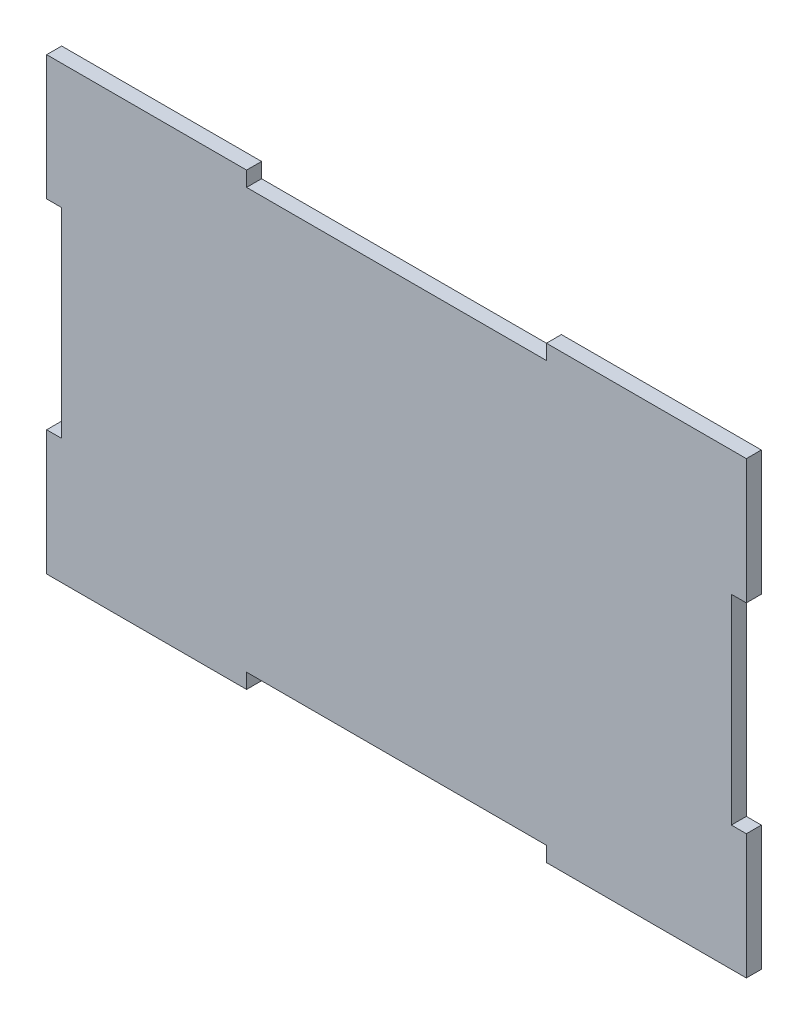
ISO-10303-21;
HEADER;
FILE_DESCRIPTION(('STEP AP214'),'2;1');
FILE_NAME('part.step','',(''),(''),'','','');
FILE_SCHEMA(('AUTOMOTIVE_DESIGN { 1 0 10303 214 1 1 1 1 }'));
ENDSEC;
DATA;
#1=APPLICATION_CONTEXT('core data for automotive mechanical design processes');
#2=APPLICATION_PROTOCOL_DEFINITION('international standard','automotive_design',2000,#1);
#3=PRODUCT_CONTEXT('',#1,'mechanical');
#4=PRODUCT('Part','Part','',(#3));
#5=PRODUCT_RELATED_PRODUCT_CATEGORY('part','',(#4));
#6=PRODUCT_DEFINITION_FORMATION('','',#4);
#7=PRODUCT_DEFINITION_CONTEXT('part definition',#1,'design');
#8=PRODUCT_DEFINITION('design','',#6,#7);
#9=PRODUCT_DEFINITION_SHAPE('','',#8);
#10=(LENGTH_UNIT() NAMED_UNIT(*) SI_UNIT(.MILLI.,.METRE.));
#11=(NAMED_UNIT(*) PLANE_ANGLE_UNIT() SI_UNIT($,.RADIAN.));
#12=(NAMED_UNIT(*) SI_UNIT($,.STERADIAN.) SOLID_ANGLE_UNIT());
#13=UNCERTAINTY_MEASURE_WITH_UNIT(LENGTH_MEASURE(1.E-05),#10,'distance_accuracy_value','');
#14=(GEOMETRIC_REPRESENTATION_CONTEXT(3) GLOBAL_UNCERTAINTY_ASSIGNED_CONTEXT((#13)) GLOBAL_UNIT_ASSIGNED_CONTEXT((#10,
#11,#12)) REPRESENTATION_CONTEXT('',''));
#15=CARTESIAN_POINT('',(0.,0.,0.));
#16=DIRECTION('',(0.,0.,1.));
#17=DIRECTION('',(1.,0.,0.));
#18=AXIS2_PLACEMENT_3D('',#15,#16,#17);
#19=CARTESIAN_POINT('',(0.,0.,3.));
#20=DIRECTION('',(1.,0.,0.));
#21=DIRECTION('',(0.,0.,-1.));
#22=AXIS2_PLACEMENT_3D('',#19,#20,#21);
#23=PLANE('',#22);
#24=DIRECTION('',(0.,-1.,0.));
#25=VECTOR('',#24,1.);
#26=CARTESIAN_POINT('',(0.,0.,0.));
#27=LINE('',#26,#25);
#28=CARTESIAN_POINT('',(0.,25.,0.));
#29=VERTEX_POINT('',#28);
#30=CARTESIAN_POINT('',(0.,0.,0.));
#31=VERTEX_POINT('',#30);
#32=EDGE_CURVE('E202',#29,#31,#27,.T.);
#33=ORIENTED_EDGE('',*,*,#32,.T.);
#34=DIRECTION('',(0.,0.,-1.));
#35=VECTOR('',#34,1.);
#36=CARTESIAN_POINT('',(0.,0.,3.));
#37=LINE('',#36,#35);
#38=CARTESIAN_POINT('',(0.,0.,3.));
#39=VERTEX_POINT('',#38);
#40=EDGE_CURVE('E11',#39,#31,#37,.T.);
#41=ORIENTED_EDGE('',*,*,#40,.F.);
#42=DIRECTION('',(0.,-1.,0.));
#43=VECTOR('',#42,1.);
#44=CARTESIAN_POINT('',(0.,0.,3.));
#45=LINE('',#44,#43);
#46=CARTESIAN_POINT('',(0.,25.,3.));
#47=VERTEX_POINT('',#46);
#48=EDGE_CURVE('E240',#47,#39,#45,.T.);
#49=ORIENTED_EDGE('',*,*,#48,.F.);
#50=DIRECTION('',(0.,0.,-1.));
#51=VECTOR('',#50,1.);
#52=CARTESIAN_POINT('',(0.,25.,3.));
#53=LINE('',#52,#51);
#54=EDGE_CURVE('E198',#47,#29,#53,.T.);
#55=ORIENTED_EDGE('',*,*,#54,.T.);
#56=EDGE_LOOP('',(#33,#41,#49,#55));
#57=FACE_BOUND('',#56,.T.);
#58=ADVANCED_FACE('F34',(#57),#23,.F.);
#59=CARTESIAN_POINT('',(0.,0.,3.));
#60=DIRECTION('',(0.,1.,0.));
#61=DIRECTION('',(0.,0.,1.));
#62=AXIS2_PLACEMENT_3D('',#59,#60,#61);
#63=PLANE('',#62);
#64=DIRECTION('',(1.,0.,0.));
#65=VECTOR('',#64,1.);
#66=CARTESIAN_POINT('',(0.,0.,0.));
#67=LINE('',#66,#65);
#68=CARTESIAN_POINT('',(40.,0.,0.));
#69=VERTEX_POINT('',#68);
#70=EDGE_CURVE('E205',#31,#69,#67,.T.);
#71=ORIENTED_EDGE('',*,*,#70,.T.);
#72=DIRECTION('',(0.,0.,-1.));
#73=VECTOR('',#72,1.);
#74=CARTESIAN_POINT('',(40.,0.,3.));
#75=LINE('',#74,#73);
#76=CARTESIAN_POINT('',(40.,0.,3.));
#77=VERTEX_POINT('',#76);
#78=EDGE_CURVE('E42',#77,#69,#75,.T.);
#79=ORIENTED_EDGE('',*,*,#78,.F.);
#80=DIRECTION('',(1.,0.,0.));
#81=VECTOR('',#80,1.);
#82=CARTESIAN_POINT('',(0.,0.,3.));
#83=LINE('',#82,#81);
#84=EDGE_CURVE('E129',#39,#77,#83,.T.);
#85=ORIENTED_EDGE('',*,*,#84,.F.);
#86=ORIENTED_EDGE('',*,*,#40,.T.);
#87=EDGE_LOOP('',(#71,#79,#85,#86));
#88=FACE_BOUND('',#87,.T.);
#89=ADVANCED_FACE('F358',(#88),#63,.F.);
#90=CARTESIAN_POINT('',(40.,0.,3.));
#91=DIRECTION('',(-1.,0.,0.));
#92=DIRECTION('',(0.,0.,1.));
#93=AXIS2_PLACEMENT_3D('',#90,#91,#92);
#94=PLANE('',#93);
#95=DIRECTION('',(0.,1.,0.));
#96=VECTOR('',#95,1.);
#97=CARTESIAN_POINT('',(40.,0.,0.));
#98=LINE('',#97,#96);
#99=CARTESIAN_POINT('',(40.,3.,0.));
#100=VERTEX_POINT('',#99);
#101=EDGE_CURVE('E207',#69,#100,#98,.T.);
#102=ORIENTED_EDGE('',*,*,#101,.T.);
#103=DIRECTION('',(0.,0.,-1.));
#104=VECTOR('',#103,1.);
#105=CARTESIAN_POINT('',(40.,3.,3.));
#106=LINE('',#105,#104);
#107=CARTESIAN_POINT('',(40.,3.,3.));
#108=VERTEX_POINT('',#107);
#109=EDGE_CURVE('E283',#108,#100,#106,.T.);
#110=ORIENTED_EDGE('',*,*,#109,.F.);
#111=DIRECTION('',(0.,1.,0.));
#112=VECTOR('',#111,1.);
#113=CARTESIAN_POINT('',(40.,0.,3.));
#114=LINE('',#113,#112);
#115=EDGE_CURVE('E291',#77,#108,#114,.T.);
#116=ORIENTED_EDGE('',*,*,#115,.F.);
#117=ORIENTED_EDGE('',*,*,#78,.T.);
#118=EDGE_LOOP('',(#102,#110,#116,#117));
#119=FACE_BOUND('',#118,.T.);
#120=ADVANCED_FACE('F289',(#119),#94,.F.);
#121=CARTESIAN_POINT('',(40.,3.,3.));
#122=DIRECTION('',(0.,1.,0.));
#123=DIRECTION('',(-1.,0.,0.));
#124=AXIS2_PLACEMENT_3D('',#121,#122,#123);
#125=PLANE('',#124);
#126=DIRECTION('',(1.,0.,0.));
#127=VECTOR('',#126,1.);
#128=CARTESIAN_POINT('',(40.,3.,0.));
#129=LINE('',#128,#127);
#130=CARTESIAN_POINT('',(100.,3.,0.));
#131=VERTEX_POINT('',#130);
#132=EDGE_CURVE('E209',#100,#131,#129,.T.);
#133=ORIENTED_EDGE('',*,*,#132,.T.);
#134=DIRECTION('',(0.,0.,-1.));
#135=VECTOR('',#134,1.);
#136=CARTESIAN_POINT('',(100.,3.,3.));
#137=LINE('',#136,#135);
#138=CARTESIAN_POINT('',(100.,3.,3.));
#139=VERTEX_POINT('',#138);
#140=EDGE_CURVE('E280',#139,#131,#137,.T.);
#141=ORIENTED_EDGE('',*,*,#140,.F.);
#142=DIRECTION('',(1.,0.,0.));
#143=VECTOR('',#142,1.);
#144=CARTESIAN_POINT('',(40.,3.,3.));
#145=LINE('',#144,#143);
#146=EDGE_CURVE('E309',#108,#139,#145,.T.);
#147=ORIENTED_EDGE('',*,*,#146,.F.);
#148=ORIENTED_EDGE('',*,*,#109,.T.);
#149=EDGE_LOOP('',(#133,#141,#147,#148));
#150=FACE_BOUND('',#149,.T.);
#151=ADVANCED_FACE('F300',(#150),#125,.F.);
#152=CARTESIAN_POINT('',(100.,0.,3.));
#153=DIRECTION('',(1.,0.,0.));
#154=DIRECTION('',(0.,0.,-1.));
#155=AXIS2_PLACEMENT_3D('',#152,#153,#154);
#156=PLANE('',#155);
#157=DIRECTION('',(0.,-1.,0.));
#158=VECTOR('',#157,1.);
#159=CARTESIAN_POINT('',(100.,0.,0.));
#160=LINE('',#159,#158);
#161=CARTESIAN_POINT('',(100.,0.,0.));
#162=VERTEX_POINT('',#161);
#163=EDGE_CURVE('E211',#131,#162,#160,.T.);
#164=ORIENTED_EDGE('',*,*,#163,.T.);
#165=DIRECTION('',(0.,0.,-1.));
#166=VECTOR('',#165,1.);
#167=CARTESIAN_POINT('',(100.,0.,3.));
#168=LINE('',#167,#166);
#169=CARTESIAN_POINT('',(100.,0.,3.));
#170=VERTEX_POINT('',#169);
#171=EDGE_CURVE('E277',#170,#162,#168,.T.);
#172=ORIENTED_EDGE('',*,*,#171,.F.);
#173=DIRECTION('',(0.,-1.,0.));
#174=VECTOR('',#173,1.);
#175=CARTESIAN_POINT('',(100.,0.,3.));
#176=LINE('',#175,#174);
#177=EDGE_CURVE('E306',#139,#170,#176,.T.);
#178=ORIENTED_EDGE('',*,*,#177,.F.);
#179=ORIENTED_EDGE('',*,*,#140,.T.);
#180=EDGE_LOOP('',(#164,#172,#178,#179));
#181=FACE_BOUND('',#180,.T.);
#182=ADVANCED_FACE('F304',(#181),#156,.F.);
#183=CARTESIAN_POINT('',(140.,0.,3.));
#184=DIRECTION('',(0.,1.,0.));
#185=DIRECTION('',(0.,0.,1.));
#186=AXIS2_PLACEMENT_3D('',#183,#184,#185);
#187=PLANE('',#186);
#188=DIRECTION('',(1.,0.,0.));
#189=VECTOR('',#188,1.);
#190=CARTESIAN_POINT('',(140.,0.,0.));
#191=LINE('',#190,#189);
#192=CARTESIAN_POINT('',(140.,0.,0.));
#193=VERTEX_POINT('',#192);
#194=EDGE_CURVE('E213',#162,#193,#191,.T.);
#195=ORIENTED_EDGE('',*,*,#194,.T.);
#196=DIRECTION('',(0.,0.,-1.));
#197=VECTOR('',#196,1.);
#198=CARTESIAN_POINT('',(140.,0.,3.));
#199=LINE('',#198,#197);
#200=CARTESIAN_POINT('',(140.,0.,3.));
#201=VERTEX_POINT('',#200);
#202=EDGE_CURVE('E274',#201,#193,#199,.T.);
#203=ORIENTED_EDGE('',*,*,#202,.F.);
#204=DIRECTION('',(1.,0.,0.));
#205=VECTOR('',#204,1.);
#206=CARTESIAN_POINT('',(140.,0.,3.));
#207=LINE('',#206,#205);
#208=EDGE_CURVE('E308',#170,#201,#207,.T.);
#209=ORIENTED_EDGE('',*,*,#208,.F.);
#210=ORIENTED_EDGE('',*,*,#171,.T.);
#211=EDGE_LOOP('',(#195,#203,#209,#210));
#212=FACE_BOUND('',#211,.T.);
#213=ADVANCED_FACE('F371',(#212),#187,.F.);
#214=CARTESIAN_POINT('',(140.,0.,3.));
#215=DIRECTION('',(-1.,0.,0.));
#216=DIRECTION('',(0.,0.,1.));
#217=AXIS2_PLACEMENT_3D('',#214,#215,#216);
#218=PLANE('',#217);
#219=DIRECTION('',(0.,1.,0.));
#220=VECTOR('',#219,1.);
#221=CARTESIAN_POINT('',(140.,0.,0.));
#222=LINE('',#221,#220);
#223=CARTESIAN_POINT('',(140.,25.,0.));
#224=VERTEX_POINT('',#223);
#225=EDGE_CURVE('E215',#193,#224,#222,.T.);
#226=ORIENTED_EDGE('',*,*,#225,.T.);
#227=DIRECTION('',(0.,0.,-1.));
#228=VECTOR('',#227,1.);
#229=CARTESIAN_POINT('',(140.,25.,3.));
#230=LINE('',#229,#228);
#231=CARTESIAN_POINT('',(140.,25.,3.));
#232=VERTEX_POINT('',#231);
#233=EDGE_CURVE('E271',#232,#224,#230,.T.);
#234=ORIENTED_EDGE('',*,*,#233,.F.);
#235=DIRECTION('',(0.,1.,0.));
#236=VECTOR('',#235,1.);
#237=CARTESIAN_POINT('',(140.,0.,3.));
#238=LINE('',#237,#236);
#239=EDGE_CURVE('E311',#201,#232,#238,.T.);
#240=ORIENTED_EDGE('',*,*,#239,.F.);
#241=ORIENTED_EDGE('',*,*,#202,.T.);
#242=EDGE_LOOP('',(#226,#234,#240,#241));
#243=FACE_BOUND('',#242,.T.);
#244=ADVANCED_FACE('F374',(#243),#218,.F.);
#245=CARTESIAN_POINT('',(140.,25.,3.));
#246=DIRECTION('',(0.,-1.,0.));
#247=DIRECTION('',(0.,0.,-1.));
#248=AXIS2_PLACEMENT_3D('',#245,#246,#247);
#249=PLANE('',#248);
#250=DIRECTION('',(-1.,0.,0.));
#251=VECTOR('',#250,1.);
#252=CARTESIAN_POINT('',(140.,25.,0.));
#253=LINE('',#252,#251);
#254=CARTESIAN_POINT('',(137.,25.,0.));
#255=VERTEX_POINT('',#254);
#256=EDGE_CURVE('E217',#224,#255,#253,.T.);
#257=ORIENTED_EDGE('',*,*,#256,.T.);
#258=DIRECTION('',(0.,0.,-1.));
#259=VECTOR('',#258,1.);
#260=CARTESIAN_POINT('',(137.,25.,3.));
#261=LINE('',#260,#259);
#262=CARTESIAN_POINT('',(137.,25.,3.));
#263=VERTEX_POINT('',#262);
#264=EDGE_CURVE('E268',#263,#255,#261,.T.);
#265=ORIENTED_EDGE('',*,*,#264,.F.);
#266=DIRECTION('',(-1.,0.,0.));
#267=VECTOR('',#266,1.);
#268=CARTESIAN_POINT('',(140.,25.,3.));
#269=LINE('',#268,#267);
#270=EDGE_CURVE('E317',#232,#263,#269,.T.);
#271=ORIENTED_EDGE('',*,*,#270,.F.);
#272=ORIENTED_EDGE('',*,*,#233,.T.);
#273=EDGE_LOOP('',(#257,#265,#271,#272));
#274=FACE_BOUND('',#273,.T.);
#275=ADVANCED_FACE('F378',(#274),#249,.F.);
#276=CARTESIAN_POINT('',(137.,25.,3.));
#277=DIRECTION('',(-1.,0.,0.));
#278=DIRECTION('',(0.,0.,1.));
#279=AXIS2_PLACEMENT_3D('',#276,#277,#278);
#280=PLANE('',#279);
#281=DIRECTION('',(0.,1.,0.));
#282=VECTOR('',#281,1.);
#283=CARTESIAN_POINT('',(137.,25.,0.));
#284=LINE('',#283,#282);
#285=CARTESIAN_POINT('',(137.,65.,0.));
#286=VERTEX_POINT('',#285);
#287=EDGE_CURVE('E219',#255,#286,#284,.T.);
#288=ORIENTED_EDGE('',*,*,#287,.T.);
#289=DIRECTION('',(0.,0.,-1.));
#290=VECTOR('',#289,1.);
#291=CARTESIAN_POINT('',(137.,65.,3.));
#292=LINE('',#291,#290);
#293=CARTESIAN_POINT('',(137.,65.,3.));
#294=VERTEX_POINT('',#293);
#295=EDGE_CURVE('E265',#294,#286,#292,.T.);
#296=ORIENTED_EDGE('',*,*,#295,.F.);
#297=DIRECTION('',(0.,1.,0.));
#298=VECTOR('',#297,1.);
#299=CARTESIAN_POINT('',(137.,25.,3.));
#300=LINE('',#299,#298);
#301=EDGE_CURVE('E319',#263,#294,#300,.T.);
#302=ORIENTED_EDGE('',*,*,#301,.F.);
#303=ORIENTED_EDGE('',*,*,#264,.T.);
#304=EDGE_LOOP('',(#288,#296,#302,#303));
#305=FACE_BOUND('',#304,.T.);
#306=ADVANCED_FACE('F382',(#305),#280,.F.);
#307=CARTESIAN_POINT('',(140.,65.,3.));
#308=DIRECTION('',(0.,1.,0.));
#309=DIRECTION('',(0.,0.,1.));
#310=AXIS2_PLACEMENT_3D('',#307,#308,#309);
#311=PLANE('',#310);
#312=DIRECTION('',(1.,0.,0.));
#313=VECTOR('',#312,1.);
#314=CARTESIAN_POINT('',(140.,65.,0.));
#315=LINE('',#314,#313);
#316=CARTESIAN_POINT('',(140.,65.,0.));
#317=VERTEX_POINT('',#316);
#318=EDGE_CURVE('E221',#286,#317,#315,.T.);
#319=ORIENTED_EDGE('',*,*,#318,.T.);
#320=DIRECTION('',(0.,0.,-1.));
#321=VECTOR('',#320,1.);
#322=CARTESIAN_POINT('',(140.,65.,3.));
#323=LINE('',#322,#321);
#324=CARTESIAN_POINT('',(140.,65.,3.));
#325=VERTEX_POINT('',#324);
#326=EDGE_CURVE('E262',#325,#317,#323,.T.);
#327=ORIENTED_EDGE('',*,*,#326,.F.);
#328=DIRECTION('',(1.,0.,0.));
#329=VECTOR('',#328,1.);
#330=CARTESIAN_POINT('',(140.,65.,3.));
#331=LINE('',#330,#329);
#332=EDGE_CURVE('E321',#294,#325,#331,.T.);
#333=ORIENTED_EDGE('',*,*,#332,.F.);
#334=ORIENTED_EDGE('',*,*,#295,.T.);
#335=EDGE_LOOP('',(#319,#327,#333,#334));
#336=FACE_BOUND('',#335,.T.);
#337=ADVANCED_FACE('F386',(#336),#311,.F.);
#338=CARTESIAN_POINT('',(140.,90.,3.));
#339=DIRECTION('',(-1.,0.,0.));
#340=DIRECTION('',(0.,0.,1.));
#341=AXIS2_PLACEMENT_3D('',#338,#339,#340);
#342=PLANE('',#341);
#343=DIRECTION('',(0.,1.,0.));
#344=VECTOR('',#343,1.);
#345=CARTESIAN_POINT('',(140.,90.,0.));
#346=LINE('',#345,#344);
#347=CARTESIAN_POINT('',(140.,90.,0.));
#348=VERTEX_POINT('',#347);
#349=EDGE_CURVE('E223',#317,#348,#346,.T.);
#350=ORIENTED_EDGE('',*,*,#349,.T.);
#351=DIRECTION('',(0.,0.,-1.));
#352=VECTOR('',#351,1.);
#353=CARTESIAN_POINT('',(140.,90.,3.));
#354=LINE('',#353,#352);
#355=CARTESIAN_POINT('',(140.,90.,3.));
#356=VERTEX_POINT('',#355);
#357=EDGE_CURVE('E259',#356,#348,#354,.T.);
#358=ORIENTED_EDGE('',*,*,#357,.F.);
#359=DIRECTION('',(0.,1.,0.));
#360=VECTOR('',#359,1.);
#361=CARTESIAN_POINT('',(140.,90.,3.));
#362=LINE('',#361,#360);
#363=EDGE_CURVE('E323',#325,#356,#362,.T.);
#364=ORIENTED_EDGE('',*,*,#363,.F.);
#365=ORIENTED_EDGE('',*,*,#326,.T.);
#366=EDGE_LOOP('',(#350,#358,#364,#365));
#367=FACE_BOUND('',#366,.T.);
#368=ADVANCED_FACE('F390',(#367),#342,.F.);
#369=CARTESIAN_POINT('',(140.,90.,3.));
#370=DIRECTION('',(0.,-1.,0.));
#371=DIRECTION('',(0.,0.,-1.));
#372=AXIS2_PLACEMENT_3D('',#369,#370,#371);
#373=PLANE('',#372);
#374=DIRECTION('',(-1.,0.,0.));
#375=VECTOR('',#374,1.);
#376=CARTESIAN_POINT('',(140.,90.,0.));
#377=LINE('',#376,#375);
#378=CARTESIAN_POINT('',(100.,90.,0.));
#379=VERTEX_POINT('',#378);
#380=EDGE_CURVE('E225',#348,#379,#377,.T.);
#381=ORIENTED_EDGE('',*,*,#380,.T.);
#382=DIRECTION('',(0.,0.,-1.));
#383=VECTOR('',#382,1.);
#384=CARTESIAN_POINT('',(100.,90.,3.));
#385=LINE('',#384,#383);
#386=CARTESIAN_POINT('',(100.,90.,3.));
#387=VERTEX_POINT('',#386);
#388=EDGE_CURVE('E256',#387,#379,#385,.T.);
#389=ORIENTED_EDGE('',*,*,#388,.F.);
#390=DIRECTION('',(-1.,0.,0.));
#391=VECTOR('',#390,1.);
#392=CARTESIAN_POINT('',(140.,90.,3.));
#393=LINE('',#392,#391);
#394=EDGE_CURVE('E325',#356,#387,#393,.T.);
#395=ORIENTED_EDGE('',*,*,#394,.F.);
#396=ORIENTED_EDGE('',*,*,#357,.T.);
#397=EDGE_LOOP('',(#381,#389,#395,#396));
#398=FACE_BOUND('',#397,.T.);
#399=ADVANCED_FACE('F394',(#398),#373,.F.);
#400=CARTESIAN_POINT('',(100.,90.,3.));
#401=DIRECTION('',(1.,0.,0.));
#402=DIRECTION('',(0.,0.,-1.));
#403=AXIS2_PLACEMENT_3D('',#400,#401,#402);
#404=PLANE('',#403);
#405=DIRECTION('',(0.,-1.,0.));
#406=VECTOR('',#405,1.);
#407=CARTESIAN_POINT('',(100.,90.,0.));
#408=LINE('',#407,#406);
#409=CARTESIAN_POINT('',(100.,87.,0.));
#410=VERTEX_POINT('',#409);
#411=EDGE_CURVE('E227',#379,#410,#408,.T.);
#412=ORIENTED_EDGE('',*,*,#411,.T.);
#413=DIRECTION('',(0.,0.,-1.));
#414=VECTOR('',#413,1.);
#415=CARTESIAN_POINT('',(100.,87.,3.));
#416=LINE('',#415,#414);
#417=CARTESIAN_POINT('',(100.,87.,3.));
#418=VERTEX_POINT('',#417);
#419=EDGE_CURVE('E253',#418,#410,#416,.T.);
#420=ORIENTED_EDGE('',*,*,#419,.F.);
#421=DIRECTION('',(0.,-1.,0.));
#422=VECTOR('',#421,1.);
#423=CARTESIAN_POINT('',(100.,90.,3.));
#424=LINE('',#423,#422);
#425=EDGE_CURVE('E327',#387,#418,#424,.T.);
#426=ORIENTED_EDGE('',*,*,#425,.F.);
#427=ORIENTED_EDGE('',*,*,#388,.T.);
#428=EDGE_LOOP('',(#412,#420,#426,#427));
#429=FACE_BOUND('',#428,.T.);
#430=ADVANCED_FACE('F398',(#429),#404,.F.);
#431=CARTESIAN_POINT('',(40.,87.,3.));
#432=DIRECTION('',(0.,-1.,0.));
#433=DIRECTION('',(0.,0.,-1.));
#434=AXIS2_PLACEMENT_3D('',#431,#432,#433);
#435=PLANE('',#434);
#436=DIRECTION('',(-1.,0.,0.));
#437=VECTOR('',#436,1.);
#438=CARTESIAN_POINT('',(40.,87.,0.));
#439=LINE('',#438,#437);
#440=CARTESIAN_POINT('',(40.,87.,0.));
#441=VERTEX_POINT('',#440);
#442=EDGE_CURVE('E229',#410,#441,#439,.T.);
#443=ORIENTED_EDGE('',*,*,#442,.T.);
#444=DIRECTION('',(0.,0.,-1.));
#445=VECTOR('',#444,1.);
#446=CARTESIAN_POINT('',(40.,87.,3.));
#447=LINE('',#446,#445);
#448=CARTESIAN_POINT('',(40.,87.,3.));
#449=VERTEX_POINT('',#448);
#450=EDGE_CURVE('E250',#449,#441,#447,.T.);
#451=ORIENTED_EDGE('',*,*,#450,.F.);
#452=DIRECTION('',(-1.,0.,0.));
#453=VECTOR('',#452,1.);
#454=CARTESIAN_POINT('',(40.,87.,3.));
#455=LINE('',#454,#453);
#456=EDGE_CURVE('E329',#418,#449,#455,.T.);
#457=ORIENTED_EDGE('',*,*,#456,.F.);
#458=ORIENTED_EDGE('',*,*,#419,.T.);
#459=EDGE_LOOP('',(#443,#451,#457,#458));
#460=FACE_BOUND('',#459,.T.);
#461=ADVANCED_FACE('F402',(#460),#435,.F.);
#462=CARTESIAN_POINT('',(40.,90.,3.));
#463=DIRECTION('',(-1.,0.,0.));
#464=DIRECTION('',(0.,0.,1.));
#465=AXIS2_PLACEMENT_3D('',#462,#463,#464);
#466=PLANE('',#465);
#467=DIRECTION('',(0.,1.,0.));
#468=VECTOR('',#467,1.);
#469=CARTESIAN_POINT('',(40.,90.,0.));
#470=LINE('',#469,#468);
#471=CARTESIAN_POINT('',(40.,90.,0.));
#472=VERTEX_POINT('',#471);
#473=EDGE_CURVE('E231',#441,#472,#470,.T.);
#474=ORIENTED_EDGE('',*,*,#473,.T.);
#475=DIRECTION('',(0.,0.,-1.));
#476=VECTOR('',#475,1.);
#477=CARTESIAN_POINT('',(40.,90.,3.));
#478=LINE('',#477,#476);
#479=CARTESIAN_POINT('',(40.,90.,3.));
#480=VERTEX_POINT('',#479);
#481=EDGE_CURVE('E247',#480,#472,#478,.T.);
#482=ORIENTED_EDGE('',*,*,#481,.F.);
#483=DIRECTION('',(0.,1.,0.));
#484=VECTOR('',#483,1.);
#485=CARTESIAN_POINT('',(40.,90.,3.));
#486=LINE('',#485,#484);
#487=EDGE_CURVE('E331',#449,#480,#486,.T.);
#488=ORIENTED_EDGE('',*,*,#487,.F.);
#489=ORIENTED_EDGE('',*,*,#450,.T.);
#490=EDGE_LOOP('',(#474,#482,#488,#489));
#491=FACE_BOUND('',#490,.T.);
#492=ADVANCED_FACE('F406',(#491),#466,.F.);
#493=CARTESIAN_POINT('',(0.,90.,3.));
#494=DIRECTION('',(0.,-1.,0.));
#495=DIRECTION('',(0.,0.,-1.));
#496=AXIS2_PLACEMENT_3D('',#493,#494,#495);
#497=PLANE('',#496);
#498=DIRECTION('',(-1.,0.,0.));
#499=VECTOR('',#498,1.);
#500=CARTESIAN_POINT('',(0.,90.,0.));
#501=LINE('',#500,#499);
#502=CARTESIAN_POINT('',(0.,90.,0.));
#503=VERTEX_POINT('',#502);
#504=EDGE_CURVE('E233',#472,#503,#501,.T.);
#505=ORIENTED_EDGE('',*,*,#504,.T.);
#506=DIRECTION('',(0.,0.,-1.));
#507=VECTOR('',#506,1.);
#508=CARTESIAN_POINT('',(0.,90.,3.));
#509=LINE('',#508,#507);
#510=CARTESIAN_POINT('',(0.,90.,3.));
#511=VERTEX_POINT('',#510);
#512=EDGE_CURVE('E244',#511,#503,#509,.T.);
#513=ORIENTED_EDGE('',*,*,#512,.F.);
#514=DIRECTION('',(-1.,0.,0.));
#515=VECTOR('',#514,1.);
#516=CARTESIAN_POINT('',(0.,90.,3.));
#517=LINE('',#516,#515);
#518=EDGE_CURVE('E333',#480,#511,#517,.T.);
#519=ORIENTED_EDGE('',*,*,#518,.F.);
#520=ORIENTED_EDGE('',*,*,#481,.T.);
#521=EDGE_LOOP('',(#505,#513,#519,#520));
#522=FACE_BOUND('',#521,.T.);
#523=ADVANCED_FACE('F339',(#522),#497,.F.);
#524=CARTESIAN_POINT('',(0.,90.,3.));
#525=DIRECTION('',(1.,0.,0.));
#526=DIRECTION('',(0.,0.,-1.));
#527=AXIS2_PLACEMENT_3D('',#524,#525,#526);
#528=PLANE('',#527);
#529=DIRECTION('',(0.,-1.,0.));
#530=VECTOR('',#529,1.);
#531=CARTESIAN_POINT('',(0.,90.,0.));
#532=LINE('',#531,#530);
#533=CARTESIAN_POINT('',(0.,65.,0.));
#534=VERTEX_POINT('',#533);
#535=EDGE_CURVE('E235',#503,#534,#532,.T.);
#536=ORIENTED_EDGE('',*,*,#535,.T.);
#537=DIRECTION('',(0.,0.,-1.));
#538=VECTOR('',#537,1.);
#539=CARTESIAN_POINT('',(0.,65.,3.));
#540=LINE('',#539,#538);
#541=CARTESIAN_POINT('',(0.,65.,3.));
#542=VERTEX_POINT('',#541);
#543=EDGE_CURVE('E193',#542,#534,#540,.T.);
#544=ORIENTED_EDGE('',*,*,#543,.F.);
#545=DIRECTION('',(0.,-1.,0.));
#546=VECTOR('',#545,1.);
#547=CARTESIAN_POINT('',(0.,90.,3.));
#548=LINE('',#547,#546);
#549=EDGE_CURVE('E184',#511,#542,#548,.T.);
#550=ORIENTED_EDGE('',*,*,#549,.F.);
#551=ORIENTED_EDGE('',*,*,#512,.T.);
#552=EDGE_LOOP('',(#536,#544,#550,#551));
#553=FACE_BOUND('',#552,.T.);
#554=ADVANCED_FACE('F343',(#553),#528,.F.);
#555=CARTESIAN_POINT('',(0.,65.,3.));
#556=DIRECTION('',(0.,1.,0.));
#557=DIRECTION('',(0.,0.,1.));
#558=AXIS2_PLACEMENT_3D('',#555,#556,#557);
#559=PLANE('',#558);
#560=DIRECTION('',(1.,0.,0.));
#561=VECTOR('',#560,1.);
#562=CARTESIAN_POINT('',(0.,65.,0.));
#563=LINE('',#562,#561);
#564=CARTESIAN_POINT('',(3.,65.,0.));
#565=VERTEX_POINT('',#564);
#566=EDGE_CURVE('E192',#534,#565,#563,.T.);
#567=ORIENTED_EDGE('',*,*,#566,.T.);
#568=DIRECTION('',(0.,0.,-1.));
#569=VECTOR('',#568,1.);
#570=CARTESIAN_POINT('',(3.,65.,3.));
#571=LINE('',#570,#569);
#572=CARTESIAN_POINT('',(3.,65.,3.));
#573=VERTEX_POINT('',#572);
#574=EDGE_CURVE('E189',#573,#565,#571,.T.);
#575=ORIENTED_EDGE('',*,*,#574,.F.);
#576=DIRECTION('',(1.,0.,0.));
#577=VECTOR('',#576,1.);
#578=CARTESIAN_POINT('',(0.,65.,3.));
#579=LINE('',#578,#577);
#580=EDGE_CURVE('E178',#542,#573,#579,.T.);
#581=ORIENTED_EDGE('',*,*,#580,.F.);
#582=ORIENTED_EDGE('',*,*,#543,.T.);
#583=EDGE_LOOP('',(#567,#575,#581,#582));
#584=FACE_BOUND('',#583,.T.);
#585=ADVANCED_FACE('F190',(#584),#559,.F.);
#586=CARTESIAN_POINT('',(3.,25.,3.));
#587=DIRECTION('',(1.,0.,0.));
#588=DIRECTION('',(0.,0.,-1.));
#589=AXIS2_PLACEMENT_3D('',#586,#587,#588);
#590=PLANE('',#589);
#591=DIRECTION('',(0.,-1.,0.));
#592=VECTOR('',#591,1.);
#593=CARTESIAN_POINT('',(3.,25.,0.));
#594=LINE('',#593,#592);
#595=CARTESIAN_POINT('',(3.,25.,0.));
#596=VERTEX_POINT('',#595);
#597=EDGE_CURVE('E115',#565,#596,#594,.T.);
#598=ORIENTED_EDGE('',*,*,#597,.T.);
#599=DIRECTION('',(0.,0.,-1.));
#600=VECTOR('',#599,1.);
#601=CARTESIAN_POINT('',(3.,25.,3.));
#602=LINE('',#601,#600);
#603=CARTESIAN_POINT('',(3.,25.,3.));
#604=VERTEX_POINT('',#603);
#605=EDGE_CURVE('E194',#604,#596,#602,.T.);
#606=ORIENTED_EDGE('',*,*,#605,.F.);
#607=DIRECTION('',(0.,-1.,0.));
#608=VECTOR('',#607,1.);
#609=CARTESIAN_POINT('',(3.,25.,3.));
#610=LINE('',#609,#608);
#611=EDGE_CURVE('E182',#573,#604,#610,.T.);
#612=ORIENTED_EDGE('',*,*,#611,.F.);
#613=ORIENTED_EDGE('',*,*,#574,.T.);
#614=EDGE_LOOP('',(#598,#606,#612,#613));
#615=FACE_BOUND('',#614,.T.);
#616=ADVANCED_FACE('F196',(#615),#590,.F.);
#617=CARTESIAN_POINT('',(0.,25.,3.));
#618=DIRECTION('',(0.,-1.,0.));
#619=DIRECTION('',(0.,0.,-1.));
#620=AXIS2_PLACEMENT_3D('',#617,#618,#619);
#621=PLANE('',#620);
#622=DIRECTION('',(-1.,0.,0.));
#623=VECTOR('',#622,1.);
#624=CARTESIAN_POINT('',(0.,25.,0.));
#625=LINE('',#624,#623);
#626=EDGE_CURVE('E121',#596,#29,#625,.T.);
#627=ORIENTED_EDGE('',*,*,#626,.T.);
#628=ORIENTED_EDGE('',*,*,#54,.F.);
#629=DIRECTION('',(-1.,0.,0.));
#630=VECTOR('',#629,1.);
#631=CARTESIAN_POINT('',(0.,25.,3.));
#632=LINE('',#631,#630);
#633=EDGE_CURVE('E50',#604,#47,#632,.T.);
#634=ORIENTED_EDGE('',*,*,#633,.F.);
#635=ORIENTED_EDGE('',*,*,#605,.T.);
#636=EDGE_LOOP('',(#627,#628,#634,#635));
#637=FACE_BOUND('',#636,.T.);
#638=ADVANCED_FACE('F347',(#637),#621,.F.);
#639=CARTESIAN_POINT('',(0.,0.,3.));
#640=DIRECTION('',(0.,0.,-1.));
#641=DIRECTION('',(-1.,0.,0.));
#642=AXIS2_PLACEMENT_3D('',#639,#640,#641);
#643=PLANE('',#642);
#644=ORIENTED_EDGE('',*,*,#48,.T.);
#645=ORIENTED_EDGE('',*,*,#84,.T.);
#646=ORIENTED_EDGE('',*,*,#115,.T.);
#647=ORIENTED_EDGE('',*,*,#146,.T.);
#648=ORIENTED_EDGE('',*,*,#177,.T.);
#649=ORIENTED_EDGE('',*,*,#208,.T.);
#650=ORIENTED_EDGE('',*,*,#239,.T.);
#651=ORIENTED_EDGE('',*,*,#270,.T.);
#652=ORIENTED_EDGE('',*,*,#301,.T.);
#653=ORIENTED_EDGE('',*,*,#332,.T.);
#654=ORIENTED_EDGE('',*,*,#363,.T.);
#655=ORIENTED_EDGE('',*,*,#394,.T.);
#656=ORIENTED_EDGE('',*,*,#425,.T.);
#657=ORIENTED_EDGE('',*,*,#456,.T.);
#658=ORIENTED_EDGE('',*,*,#487,.T.);
#659=ORIENTED_EDGE('',*,*,#518,.T.);
#660=ORIENTED_EDGE('',*,*,#549,.T.);
#661=ORIENTED_EDGE('',*,*,#580,.T.);
#662=ORIENTED_EDGE('',*,*,#611,.T.);
#663=ORIENTED_EDGE('',*,*,#633,.T.);
#664=EDGE_LOOP('',(#644,#645,#646,#647,#648,#649,#650,#651,#652,#653,#654,#655,#656,#657,#658,
#659,#660,#661,#662,#663));
#665=FACE_BOUND('',#664,.T.);
#666=ADVANCED_FACE('F180',(#665),#643,.F.);
#667=CARTESIAN_POINT('',(0.,0.,0.));
#668=DIRECTION('',(0.,0.,-1.));
#669=DIRECTION('',(-1.,0.,0.));
#670=AXIS2_PLACEMENT_3D('',#667,#668,#669);
#671=PLANE('',#670);
#672=ORIENTED_EDGE('',*,*,#32,.F.);
#673=ORIENTED_EDGE('',*,*,#626,.F.);
#674=ORIENTED_EDGE('',*,*,#597,.F.);
#675=ORIENTED_EDGE('',*,*,#566,.F.);
#676=ORIENTED_EDGE('',*,*,#535,.F.);
#677=ORIENTED_EDGE('',*,*,#504,.F.);
#678=ORIENTED_EDGE('',*,*,#473,.F.);
#679=ORIENTED_EDGE('',*,*,#442,.F.);
#680=ORIENTED_EDGE('',*,*,#411,.F.);
#681=ORIENTED_EDGE('',*,*,#380,.F.);
#682=ORIENTED_EDGE('',*,*,#349,.F.);
#683=ORIENTED_EDGE('',*,*,#318,.F.);
#684=ORIENTED_EDGE('',*,*,#287,.F.);
#685=ORIENTED_EDGE('',*,*,#256,.F.);
#686=ORIENTED_EDGE('',*,*,#225,.F.);
#687=ORIENTED_EDGE('',*,*,#194,.F.);
#688=ORIENTED_EDGE('',*,*,#163,.F.);
#689=ORIENTED_EDGE('',*,*,#132,.F.);
#690=ORIENTED_EDGE('',*,*,#101,.F.);
#691=ORIENTED_EDGE('',*,*,#70,.F.);
#692=EDGE_LOOP('',(#672,#673,#674,#675,#676,#677,#678,#679,#680,#681,#682,#683,#684,#685,#686,
#687,#688,#689,#690,#691));
#693=FACE_BOUND('',#692,.T.);
#694=ADVANCED_FACE('F295',(#693),#671,.T.);
#695=CLOSED_SHELL('',(#58,#89,#120,#151,#182,#213,#244,#275,#306,#337,#368,#399,#430,#461,#492,
#523,#554,#585,#616,#638,#666,#694));
#696=MANIFOLD_SOLID_BREP('B2',#695);
#697=ADVANCED_BREP_SHAPE_REPRESENTATION('',(#18,#696),#14);
#698=SHAPE_DEFINITION_REPRESENTATION(#9,#697);
ENDSEC;
END-ISO-10303-21;
